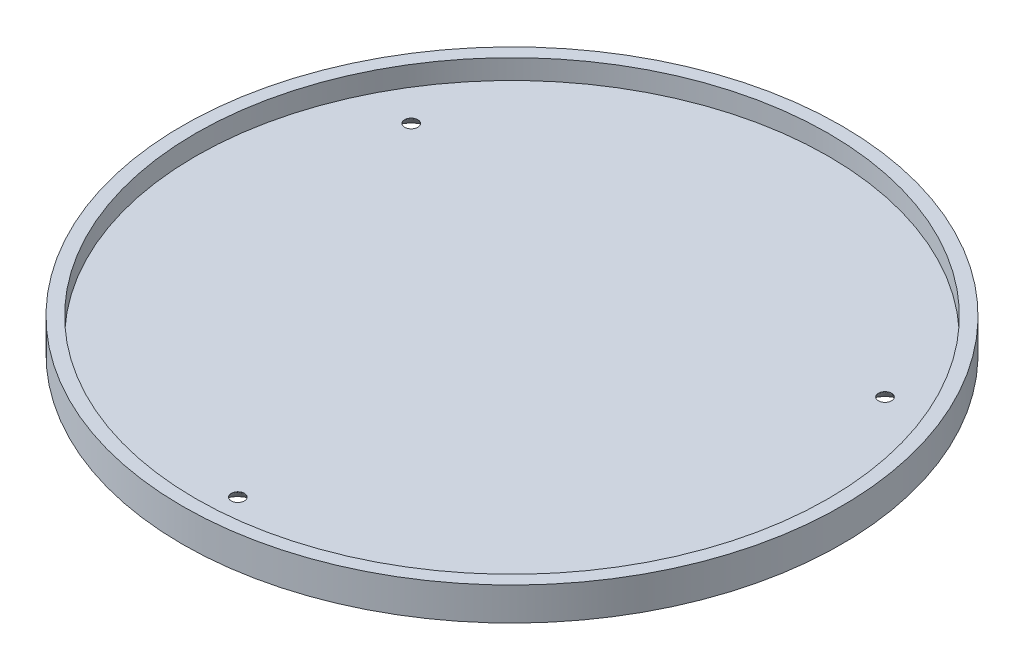
ISO-10303-21;
HEADER;
FILE_DESCRIPTION(('STEP AP214'),'2;1');
FILE_NAME('part.step','',(''),(''),'','','');
FILE_SCHEMA(('AUTOMOTIVE_DESIGN { 1 0 10303 214 1 1 1 1 }'));
ENDSEC;
DATA;
#1=APPLICATION_CONTEXT('core data for automotive mechanical design processes');
#2=APPLICATION_PROTOCOL_DEFINITION('international standard','automotive_design',2000,#1);
#3=PRODUCT_CONTEXT('',#1,'mechanical');
#4=PRODUCT('Part','Part','',(#3));
#5=PRODUCT_RELATED_PRODUCT_CATEGORY('part','',(#4));
#6=PRODUCT_DEFINITION_FORMATION('','',#4);
#7=PRODUCT_DEFINITION_CONTEXT('part definition',#1,'design');
#8=PRODUCT_DEFINITION('design','',#6,#7);
#9=PRODUCT_DEFINITION_SHAPE('','',#8);
#10=(LENGTH_UNIT() NAMED_UNIT(*) SI_UNIT(.MILLI.,.METRE.));
#11=(NAMED_UNIT(*) PLANE_ANGLE_UNIT() SI_UNIT($,.RADIAN.));
#12=(NAMED_UNIT(*) SI_UNIT($,.STERADIAN.) SOLID_ANGLE_UNIT());
#13=UNCERTAINTY_MEASURE_WITH_UNIT(LENGTH_MEASURE(1.E-05),#10,'distance_accuracy_value','');
#14=(GEOMETRIC_REPRESENTATION_CONTEXT(3) GLOBAL_UNCERTAINTY_ASSIGNED_CONTEXT((#13)) GLOBAL_UNIT_ASSIGNED_CONTEXT((#10,
#11,#12)) REPRESENTATION_CONTEXT('',''));
#15=CARTESIAN_POINT('',(0.,0.,0.));
#16=DIRECTION('',(0.,0.,1.));
#17=DIRECTION('',(1.,0.,0.));
#18=AXIS2_PLACEMENT_3D('',#15,#16,#17);
#19=CARTESIAN_POINT('',(0.,2.,0.));
#20=DIRECTION('',(0.,-1.,0.));
#21=DIRECTION('',(0.,0.,-1.));
#22=AXIS2_PLACEMENT_3D('',#19,#20,#21);
#23=CYLINDRICAL_SURFACE('',#22,50.);
#24=CARTESIAN_POINT('',(0.,0.,0.));
#25=DIRECTION('',(0.,1.,0.));
#26=DIRECTION('',(0.,0.,1.));
#27=AXIS2_PLACEMENT_3D('',#24,#25,#26);
#28=CIRCLE('',#27,50.);
#29=CARTESIAN_POINT('',(0.,0.,50.));
#30=VERTEX_POINT('',#29);
#31=EDGE_CURVE('E71',#30,#30,#28,.T.);
#32=ORIENTED_EDGE('',*,*,#31,.T.);
#33=EDGE_LOOP('',(#32));
#34=FACE_BOUND('',#33,.T.);
#35=CARTESIAN_POINT('',(0.,5.,0.));
#36=DIRECTION('',(0.,1.,0.));
#37=DIRECTION('',(0.,0.,1.));
#38=AXIS2_PLACEMENT_3D('',#35,#36,#37);
#39=CIRCLE('',#38,50.);
#40=CARTESIAN_POINT('',(0.,5.,50.));
#41=VERTEX_POINT('',#40);
#42=EDGE_CURVE('E76',#41,#41,#39,.T.);
#43=ORIENTED_EDGE('',*,*,#42,.F.);
#44=EDGE_LOOP('',(#43));
#45=FACE_BOUND('',#44,.T.);
#46=ADVANCED_FACE('F42',(#34,#45),#23,.T.);
#47=CARTESIAN_POINT('',(0.,0.,0.));
#48=DIRECTION('',(0.,1.,0.));
#49=DIRECTION('',(0.,0.,1.));
#50=AXIS2_PLACEMENT_3D('',#47,#48,#49);
#51=PLANE('',#50);
#52=CARTESIAN_POINT('',(-1.35252175889077E-13,0.,38.5985260536249));
#53=CARTESIAN_POINT('',(0.392699074426384,0.,38.5985260536249));
#54=CARTESIAN_POINT('',(0.785243659796374,0.,38.6766080264029));
#55=CARTESIAN_POINT('',(1.5108569343939,0.,38.9771668857792));
#56=CARTESIAN_POINT('',(1.84364016506682,0.,39.199525531572));
#57=CARTESIAN_POINT('',(2.3990005220522,0.,39.7548858885586));
#58=CARTESIAN_POINT('',(2.62135916784558,0.,40.0876691192299));
#59=CARTESIAN_POINT('',(2.92191802722187,0.,40.8132823938295));
#60=CARTESIAN_POINT('',(2.99999999999986,0.,41.2058269791985));
#61=CARTESIAN_POINT('',(2.99999999999986,0.,41.9912251280514));
#62=CARTESIAN_POINT('',(2.92191802722195,0.,42.3837697134218));
#63=CARTESIAN_POINT('',(2.6213591678455,0.,43.1093829880186));
#64=CARTESIAN_POINT('',(2.39900052205211,0.,43.4421662186913));
#65=CARTESIAN_POINT('',(1.8436401650669,0.,43.9975265756779));
#66=CARTESIAN_POINT('',(1.51085693439392,0.,44.2198852214707));
#67=CARTESIAN_POINT('',(0.785243659796346,0.,44.5204440808469));
#68=CARTESIAN_POINT('',(0.392699074426768,0.,44.5985260536249));
#69=CARTESIAN_POINT('',(-0.392699074427039,0.,44.5985260536249));
#70=CARTESIAN_POINT('',(-0.785243659796701,0.,44.5204440808469));
#71=CARTESIAN_POINT('',(-1.51085693439411,0.,44.2198852214707));
#72=CARTESIAN_POINT('',(-1.84364016506709,0.,43.9975265756779));
#73=CARTESIAN_POINT('',(-2.39900052205247,0.,43.4421662186913));
#74=CARTESIAN_POINT('',(-2.62135916784568,0.,43.10938298802));
#75=CARTESIAN_POINT('',(-2.92191802722231,0.,42.3837697134204));
#76=CARTESIAN_POINT('',(-3.00000000000014,0.,41.9912251280527));
#77=CARTESIAN_POINT('',(-3.00000000000014,0.,41.2058269791972));
#78=CARTESIAN_POINT('',(-2.92191802722222,0.,40.8132823938281));
#79=CARTESIAN_POINT('',(-2.62135916784577,0.,40.0876691192312));
#80=CARTESIAN_POINT('',(-2.39900052205238,0.,39.7548858885586));
#81=CARTESIAN_POINT('',(-1.84364016506717,0.,39.199525531572));
#82=CARTESIAN_POINT('',(-1.51085693439425,0.,38.9771668857792));
#83=CARTESIAN_POINT('',(-0.785243659796552,0.,38.6766080264029));
#84=CARTESIAN_POINT('',(-0.392699074426654,0.,38.5985260536249));
#85=CARTESIAN_POINT('',(-1.35252175889077E-13,0.,38.5985260536249));
#86=(BOUNDED_CURVE() B_SPLINE_CURVE(3,(#52,#53,#54,#55,#56,#57,#58,#59,#60,#61,#62,#63,#64,#65,
#66,#67,#68,#69,#70,#71,#72,#73,#74,#75,#76,#77,#78,#79,#80,#81,#82,#83,#84,#85),.UNSPECIFIED.,
.T.,.F.) B_SPLINE_CURVE_WITH_KNOTS((4,2,2,2,2,2,2,2,2,2,2,2,2,2,2,2,4),(-3.14159265358979,
-2.74889357189107,-2.35619449019234,-1.96349540849362,-1.5707963267949,-1.17809724509617,
-0.785398163397448,-0.392699081698724,0.,0.392699081698724,0.785398163397448,1.17809724509617,
1.5707963267949,1.96349540849362,2.35619449019234,2.74889357189107,3.14159265358979),
.UNSPECIFIED.) CURVE() GEOMETRIC_REPRESENTATION_ITEM() RATIONAL_B_SPLINE_CURVE((1.,1.,1.,1.,1.,
1.,1.,1.,1.,1.,1.,1.,1.,1.,1.,1.,1.,1.,1.,1.,1.,1.,1.,1.,1.,1.,1.,1.,1.,1.,1.,1.,1.,1.)) REPRESENTATION_ITEM(''));
#87=CARTESIAN_POINT('',(-1.35252175889077E-13,0.,38.5985260536249));
#88=VERTEX_POINT('',#87);
#89=EDGE_CURVE('E11',#88,#88,#86,.F.);
#90=ORIENTED_EDGE('',*,*,#89,.T.);
#91=EDGE_LOOP('',(#90));
#92=FACE_BOUND('',#91,.T.);
#93=CARTESIAN_POINT('',(35.9400542570542,0.,-23.6514739463751));
#94=CARTESIAN_POINT('',(36.3327533314806,0.,-23.6514739463751));
#95=CARTESIAN_POINT('',(36.7252979168511,0.,-23.5733919735971));
#96=CARTESIAN_POINT('',(37.4509111914479,0.,-23.2728331142208));
#97=CARTESIAN_POINT('',(37.7836944221219,0.,-23.0504744684274));
#98=CARTESIAN_POINT('',(38.3390547791058,0.,-22.4951141114422));
#99=CARTESIAN_POINT('',(38.5614134248999,0.,-22.1623308807695));
#100=CARTESIAN_POINT('',(38.8619722842762,0.,-21.4367176061713));
#101=CARTESIAN_POINT('',(38.9400542570542,0.,-21.0441730208015));
#102=CARTESIAN_POINT('',(38.9400542570542,0.,-20.2587748719487));
#103=CARTESIAN_POINT('',(38.8619722842762,0.,-19.8662302865783));
#104=CARTESIAN_POINT('',(38.5614134248999,0.,-19.1406170119814));
#105=CARTESIAN_POINT('',(38.3390547791058,0.,-18.8078337813081));
#106=CARTESIAN_POINT('',(37.7836944221219,0.,-18.2524734243229));
#107=CARTESIAN_POINT('',(37.4509111914478,0.,-18.0301147785294));
#108=CARTESIAN_POINT('',(36.7252979168511,0.,-17.7295559191531));
#109=CARTESIAN_POINT('',(36.3327533314806,0.,-17.6514739463751));
#110=CARTESIAN_POINT('',(35.5473551826278,0.,-17.6514739463751));
#111=CARTESIAN_POINT('',(35.1548105972573,0.,-17.7295559191531));
#112=CARTESIAN_POINT('',(34.4291973226606,0.,-18.0301147785294));
#113=CARTESIAN_POINT('',(34.0964140919865,0.,-18.2524734243229));
#114=CARTESIAN_POINT('',(33.5410537350026,0.,-18.8078337813081));
#115=CARTESIAN_POINT('',(33.3186950892085,0.,-19.1406170119807));
#116=CARTESIAN_POINT('',(33.0181362298322,0.,-19.8662302865789));
#117=CARTESIAN_POINT('',(32.9400542570542,0.,-20.2587748719487));
#118=CARTESIAN_POINT('',(32.9400542570542,0.,-21.0441730208015));
#119=CARTESIAN_POINT('',(33.0181362298308,0.,-21.436717606172));
#120=CARTESIAN_POINT('',(33.3186950892098,0.,-22.1623308807688));
#121=CARTESIAN_POINT('',(33.5410537350026,0.,-22.4951141114421));
#122=CARTESIAN_POINT('',(34.0964140919865,0.,-23.0504744684274));
#123=CARTESIAN_POINT('',(34.4291973226605,0.,-23.2728331142208));
#124=CARTESIAN_POINT('',(35.1548105972574,0.,-23.5733919735971));
#125=CARTESIAN_POINT('',(35.5473551826278,0.,-23.6514739463751));
#126=CARTESIAN_POINT('',(35.9400542570542,0.,-23.6514739463751));
#127=(BOUNDED_CURVE() B_SPLINE_CURVE(3,(#93,#94,#95,#96,#97,#98,#99,#100,#101,#102,#103,#104,
#105,#106,#107,#108,#109,#110,#111,#112,#113,#114,#115,#116,#117,#118,#119,#120,#121,#122,#123,
#124,#125,#126),.UNSPECIFIED.,.T.,.F.) B_SPLINE_CURVE_WITH_KNOTS((4,2,2,2,2,2,2,2,2,2,2,2,2,2,2,
2,4),(-3.14159265358979,-2.74889357189107,-2.35619449019234,-1.96349540849362,-1.5707963267949,
-1.17809724509617,-0.785398163397448,-0.392699081698724,0.,0.392699081698724,0.785398163397448,
1.17809724509617,1.5707963267949,1.96349540849362,2.35619449019234,2.74889357189107,
3.14159265358979),
.UNSPECIFIED.) CURVE() GEOMETRIC_REPRESENTATION_ITEM() RATIONAL_B_SPLINE_CURVE((1.,1.,1.,1.,1.,
1.,1.,1.,1.,1.,1.,1.,1.,1.,1.,1.,1.,1.,1.,1.,1.,1.,1.,1.,1.,1.,1.,1.,1.,1.,1.,1.,1.,1.)) REPRESENTATION_ITEM(''));
#128=CARTESIAN_POINT('',(35.9400542570542,0.,-23.6514739463751));
#129=VERTEX_POINT('',#128);
#130=EDGE_CURVE('E56',#129,#129,#127,.F.);
#131=ORIENTED_EDGE('',*,*,#130,.T.);
#132=EDGE_LOOP('',(#131));
#133=FACE_BOUND('',#132,.T.);
#134=CARTESIAN_POINT('',(-35.9400542570543,0.,-23.6514739463749));
#135=CARTESIAN_POINT('',(-35.5473551826279,0.,-23.6514739463749));
#136=CARTESIAN_POINT('',(-35.1548105972575,0.,-23.5733919735969));
#137=CARTESIAN_POINT('',(-34.4291973226606,0.,-23.2728331142206));
#138=CARTESIAN_POINT('',(-34.0964140919866,0.,-23.0504744684278));
#139=CARTESIAN_POINT('',(-33.5410537350027,0.,-22.4951141114412));
#140=CARTESIAN_POINT('',(-33.3186950892086,0.,-22.1623308807686));
#141=CARTESIAN_POINT('',(-33.0181362298323,0.,-21.4367176061717));
#142=CARTESIAN_POINT('',(-32.9400542570543,0.,-21.0441730208013));
#143=CARTESIAN_POINT('',(-32.9400542570543,0.,-20.2587748719484));
#144=CARTESIAN_POINT('',(-33.0181362298323,0.,-19.8662302865787));
#145=CARTESIAN_POINT('',(-33.3186950892086,0.,-19.1406170119805));
#146=CARTESIAN_POINT('',(-33.5410537350014,0.,-18.8078337813078));
#147=CARTESIAN_POINT('',(-34.096414091988,0.,-18.2524734243226));
#148=CARTESIAN_POINT('',(-34.4291973226607,0.,-18.0301147785284));
#149=CARTESIAN_POINT('',(-35.1548105972574,0.,-17.7295559191536));
#150=CARTESIAN_POINT('',(-35.547355182628,0.,-17.6514739463749));
#151=CARTESIAN_POINT('',(-36.3327533314807,0.,-17.6514739463749));
#152=CARTESIAN_POINT('',(-36.7252979168499,0.,-17.7295559191529));
#153=CARTESIAN_POINT('',(-37.4509111914493,0.,-18.0301147785291));
#154=CARTESIAN_POINT('',(-37.7836944221207,0.,-18.2524734243226));
#155=CARTESIAN_POINT('',(-38.3390547791072,0.,-18.8078337813078));
#156=CARTESIAN_POINT('',(-38.5614134249,0.,-19.1406170119805));
#157=CARTESIAN_POINT('',(-38.8619722842763,0.,-19.8662302865787));
#158=CARTESIAN_POINT('',(-38.9400542570543,0.,-20.2587748719484));
#159=CARTESIAN_POINT('',(-38.9400542570543,0.,-21.0441730208013));
#160=CARTESIAN_POINT('',(-38.8619722842763,0.,-21.436717606171));
#161=CARTESIAN_POINT('',(-38.5614134249,0.,-22.1623308807692));
#162=CARTESIAN_POINT('',(-38.3390547791072,0.,-22.4951141114419));
#163=CARTESIAN_POINT('',(-37.7836944221207,0.,-23.0504744684271));
#164=CARTESIAN_POINT('',(-37.450911191448,0.,-23.2728331142206));
#165=CARTESIAN_POINT('',(-36.7252979168512,0.,-23.5733919735969));
#166=CARTESIAN_POINT('',(-36.3327533314807,0.,-23.6514739463749));
#167=CARTESIAN_POINT('',(-35.9400542570543,0.,-23.6514739463749));
#168=(BOUNDED_CURVE() B_SPLINE_CURVE(3,(#134,#135,#136,#137,#138,#139,#140,#141,#142,#143,#144,
#145,#146,#147,#148,#149,#150,#151,#152,#153,#154,#155,#156,#157,#158,#159,#160,#161,#162,#163,
#164,#165,#166,#167),.UNSPECIFIED.,.T.,.F.) B_SPLINE_CURVE_WITH_KNOTS((4,2,2,2,2,2,2,2,2,2,2,2,
2,2,2,2,4),(-3.14159265358979,-2.74889357189107,-2.35619449019234,-1.96349540849362,
-1.5707963267949,-1.17809724509617,-0.785398163397448,-0.392699081698724,0.,0.392699081698724,
0.785398163397448,1.17809724509617,1.5707963267949,1.96349540849362,2.35619449019234,
2.74889357189107,3.14159265358979),
.UNSPECIFIED.) CURVE() GEOMETRIC_REPRESENTATION_ITEM() RATIONAL_B_SPLINE_CURVE((1.,1.,1.,1.,1.,
1.,1.,1.,1.,1.,1.,1.,1.,1.,1.,1.,1.,1.,1.,1.,1.,1.,1.,1.,1.,1.,1.,1.,1.,1.,1.,1.,1.,1.)) REPRESENTATION_ITEM(''));
#169=CARTESIAN_POINT('',(-35.9400542570543,0.,-23.6514739463749));
#170=VERTEX_POINT('',#169);
#171=EDGE_CURVE('E61',#170,#170,#168,.F.);
#172=ORIENTED_EDGE('',*,*,#171,.T.);
#173=EDGE_LOOP('',(#172));
#174=FACE_BOUND('',#173,.T.);
#175=ORIENTED_EDGE('',*,*,#31,.F.);
#176=EDGE_LOOP('',(#175));
#177=FACE_BOUND('',#176,.T.);
#178=ADVANCED_FACE('F84',(#92,#133,#174,#177),#51,.F.);
#179=CARTESIAN_POINT('',(0.,5.,0.));
#180=DIRECTION('',(0.,1.,0.));
#181=DIRECTION('',(0.,0.,1.));
#182=AXIS2_PLACEMENT_3D('',#179,#180,#181);
#183=PLANE('',#182);
#184=ORIENTED_EDGE('',*,*,#42,.T.);
#185=EDGE_LOOP('',(#184));
#186=FACE_BOUND('',#185,.T.);
#187=CARTESIAN_POINT('',(0.,5.,0.));
#188=DIRECTION('',(0.,1.,0.));
#189=DIRECTION('',(0.,0.,1.));
#190=AXIS2_PLACEMENT_3D('',#187,#188,#189);
#191=CIRCLE('',#190,48.);
#192=CARTESIAN_POINT('',(0.,5.,48.));
#193=VERTEX_POINT('',#192);
#194=EDGE_CURVE('E224',#193,#193,#191,.T.);
#195=ORIENTED_EDGE('',*,*,#194,.F.);
#196=EDGE_LOOP('',(#195));
#197=FACE_BOUND('',#196,.T.);
#198=ADVANCED_FACE('F93',(#186,#197),#183,.T.);
#199=CARTESIAN_POINT('',(0.,5.,0.));
#200=DIRECTION('',(0.,-1.,0.));
#201=DIRECTION('',(0.,0.,-1.));
#202=AXIS2_PLACEMENT_3D('',#199,#200,#201);
#203=CYLINDRICAL_SURFACE('',#202,48.);
#204=ORIENTED_EDGE('',*,*,#194,.T.);
#205=EDGE_LOOP('',(#204));
#206=FACE_BOUND('',#205,.T.);
#207=CARTESIAN_POINT('',(0.,2.,0.));
#208=DIRECTION('',(0.,1.,0.));
#209=DIRECTION('',(0.,0.,1.));
#210=AXIS2_PLACEMENT_3D('',#207,#208,#209);
#211=CIRCLE('',#210,48.);
#212=CARTESIAN_POINT('',(0.,2.,48.));
#213=VERTEX_POINT('',#212);
#214=EDGE_CURVE('E66',#213,#213,#211,.F.);
#215=ORIENTED_EDGE('',*,*,#214,.T.);
#216=EDGE_LOOP('',(#215));
#217=FACE_BOUND('',#216,.T.);
#218=ADVANCED_FACE('F256',(#206,#217),#203,.F.);
#219=CARTESIAN_POINT('',(0.,2.,0.));
#220=DIRECTION('',(0.,1.,0.));
#221=DIRECTION('',(0.,0.,1.));
#222=AXIS2_PLACEMENT_3D('',#219,#220,#221);
#223=PLANE('',#222);
#224=CARTESIAN_POINT('',(-1.35497105248907E-13,2.,40.5985260536249));
#225=CARTESIAN_POINT('',(-0.130899691475642,2.,40.5985260536249));
#226=CARTESIAN_POINT('',(-0.261747886599258,2.,40.6245533778844));
#227=CARTESIAN_POINT('',(-0.50361897813119,2.,40.7247396643429));
#228=CARTESIAN_POINT('',(-0.614546721688915,2.,40.7988592129406));
#229=CARTESIAN_POINT('',(-0.799666840684453,2.,40.9839793319362));
#230=CARTESIAN_POINT('',(-0.873786389282064,2.,41.0949070754936));
#231=CARTESIAN_POINT('',(-0.973972675740781,2.,41.3367781670261));
#232=CARTESIAN_POINT('',(-1.00000000000014,2.,41.4676263621486));
#233=CARTESIAN_POINT('',(-1.00000000000014,2.,41.7294257451013));
#234=CARTESIAN_POINT('',(-0.973972675740756,2.,41.8602739402239));
#235=CARTESIAN_POINT('',(-0.873786389282089,2.,42.1021450317562));
#236=CARTESIAN_POINT('',(-0.799666840684451,2.,42.2130727753137));
#237=CARTESIAN_POINT('',(-0.614546721688913,2.,42.3981928943093));
#238=CARTESIAN_POINT('',(-0.503618978131135,2.,42.472312442907));
#239=CARTESIAN_POINT('',(-0.261747886599316,2.,42.5724987293655));
#240=CARTESIAN_POINT('',(-0.13089969147577,2.,42.5985260536249));
#241=CARTESIAN_POINT('',(0.130899691475499,2.,42.5985260536249));
#242=CARTESIAN_POINT('',(0.261747886599027,2.,42.5724987293655));
#243=CARTESIAN_POINT('',(0.503618978130882,2.,42.472312442907));
#244=CARTESIAN_POINT('',(0.614546721688643,2.,42.3981928943093));
#245=CARTESIAN_POINT('',(0.799666840684181,2.,42.2130727753137));
#246=CARTESIAN_POINT('',(0.873786389281781,2.,42.1021450317563));
#247=CARTESIAN_POINT('',(0.973972675740522,2.,41.8602739402238));
#248=CARTESIAN_POINT('',(0.999999999999864,2.,41.7294257451013));
#249=CARTESIAN_POINT('',(0.999999999999864,2.,41.4676263621486));
#250=CARTESIAN_POINT('',(0.973972675740453,2.,41.3367781670259));
#251=CARTESIAN_POINT('',(0.873786389281848,2.,41.0949070754938));
#252=CARTESIAN_POINT('',(0.799666840684201,2.,40.9839793319362));
#253=CARTESIAN_POINT('',(0.61454672168862,2.,40.7988592129406));
#254=CARTESIAN_POINT('',(0.503618978131384,2.,40.7247396643431));
#255=CARTESIAN_POINT('',(0.261747886598526,2.,40.6245533778842));
#256=CARTESIAN_POINT('',(0.130899691475371,2.,40.5985260536249));
#257=CARTESIAN_POINT('',(-1.35497105248907E-13,2.,40.5985260536249));
#258=(BOUNDED_CURVE() B_SPLINE_CURVE(3,(#224,#225,#226,#227,#228,#229,#230,#231,#232,#233,#234,
#235,#236,#237,#238,#239,#240,#241,#242,#243,#244,#245,#246,#247,#248,#249,#250,#251,#252,#253,
#254,#255,#256,#257),.UNSPECIFIED.,.T.,.F.) B_SPLINE_CURVE_WITH_KNOTS((4,2,2,2,2,2,2,2,2,2,2,2,
2,2,2,2,4),(-3.14159265358979,-2.74889357189107,-2.35619449019234,-1.96349540849362,
-1.5707963267949,-1.17809724509617,-0.785398163397448,-0.392699081698724,0.,0.392699081698724,
0.785398163397448,1.17809724509617,1.5707963267949,1.96349540849362,2.35619449019234,
2.74889357189107,3.14159265358979),
.UNSPECIFIED.) CURVE() GEOMETRIC_REPRESENTATION_ITEM() RATIONAL_B_SPLINE_CURVE((1.,1.,1.,1.,1.,
1.,1.,1.,1.,1.,1.,1.,1.,1.,1.,1.,1.,1.,1.,1.,1.,1.,1.,1.,1.,1.,1.,1.,1.,1.,1.,1.,1.,1.)) REPRESENTATION_ITEM(''));
#259=CARTESIAN_POINT('',(-1.35497105248907E-13,2.,40.5985260536249));
#260=VERTEX_POINT('',#259);
#261=EDGE_CURVE('E120',#260,#260,#258,.T.);
#262=ORIENTED_EDGE('',*,*,#261,.F.);
#263=EDGE_LOOP('',(#262));
#264=FACE_BOUND('',#263,.T.);
#265=CARTESIAN_POINT('',(-35.9400542570543,2.,-21.6514739463749));
#266=CARTESIAN_POINT('',(-36.0709539485307,2.,-21.6514739463749));
#267=CARTESIAN_POINT('',(-36.2018021436531,2.,-21.6254466221155));
#268=CARTESIAN_POINT('',(-36.4436732351857,2.,-21.5252603356567));
#269=CARTESIAN_POINT('',(-36.5546009787433,2.,-21.4511407870589));
#270=CARTESIAN_POINT('',(-36.7397210977384,2.,-21.2660206680639));
#271=CARTESIAN_POINT('',(-36.8138406463362,2.,-21.1550929245064));
#272=CARTESIAN_POINT('',(-36.914026932795,2.,-20.9132218329735));
#273=CARTESIAN_POINT('',(-36.9400542570543,2.,-20.7823736378506));
#274=CARTESIAN_POINT('',(-36.9400542570543,2.,-20.5205742548992));
#275=CARTESIAN_POINT('',(-36.9140269327948,2.,-20.3897260597756));
#276=CARTESIAN_POINT('',(-36.8138406463364,2.,-20.1478549682439));
#277=CARTESIAN_POINT('',(-36.7397210977384,2.,-20.0369272246858));
#278=CARTESIAN_POINT('',(-36.5546009787433,2.,-19.8518071056908));
#279=CARTESIAN_POINT('',(-36.4436732351855,2.,-19.7776875570929));
#280=CARTESIAN_POINT('',(-36.2018021436533,2.,-19.6775012706343));
#281=CARTESIAN_POINT('',(-36.0709539485307,2.,-19.6514739463749));
#282=CARTESIAN_POINT('',(-35.8091545655779,2.,-19.6514739463749));
#283=CARTESIAN_POINT('',(-35.6783063704553,2.,-19.6775012706343));
#284=CARTESIAN_POINT('',(-35.4364352789232,2.,-19.7776875570929));
#285=CARTESIAN_POINT('',(-35.3255075353653,2.,-19.8518071056908));
#286=CARTESIAN_POINT('',(-35.1403874163702,2.,-20.0369272246858));
#287=CARTESIAN_POINT('',(-35.0662678677722,2.,-20.1478549682439));
#288=CARTESIAN_POINT('',(-34.9660815813138,2.,-20.3897260597756));
#289=CARTESIAN_POINT('',(-34.9400542570543,2.,-20.5205742548998));
#290=CARTESIAN_POINT('',(-34.9400542570543,2.,-20.7823736378499));
#291=CARTESIAN_POINT('',(-34.9660815813138,2.,-20.9132218329741));
#292=CARTESIAN_POINT('',(-35.0662678677722,2.,-21.1550929245058));
#293=CARTESIAN_POINT('',(-35.1403874163702,2.,-21.2660206680639));
#294=CARTESIAN_POINT('',(-35.3255075353653,2.,-21.4511407870589));
#295=CARTESIAN_POINT('',(-35.4364352789231,2.,-21.5252603356568));
#296=CARTESIAN_POINT('',(-35.6783063704553,2.,-21.6254466221154));
#297=CARTESIAN_POINT('',(-35.8091545655779,2.,-21.6514739463749));
#298=CARTESIAN_POINT('',(-35.9400542570543,2.,-21.6514739463749));
#299=(BOUNDED_CURVE() B_SPLINE_CURVE(3,(#265,#266,#267,#268,#269,#270,#271,#272,#273,#274,#275,
#276,#277,#278,#279,#280,#281,#282,#283,#284,#285,#286,#287,#288,#289,#290,#291,#292,#293,#294,
#295,#296,#297,#298),.UNSPECIFIED.,.T.,.F.) B_SPLINE_CURVE_WITH_KNOTS((4,2,2,2,2,2,2,2,2,2,2,2,
2,2,2,2,4),(-3.14159265358979,-2.74889357189107,-2.35619449019234,-1.96349540849362,
-1.5707963267949,-1.17809724509617,-0.785398163397448,-0.392699081698724,0.,0.392699081698724,
0.785398163397448,1.17809724509617,1.5707963267949,1.96349540849362,2.35619449019234,
2.74889357189107,3.14159265358979),
.UNSPECIFIED.) CURVE() GEOMETRIC_REPRESENTATION_ITEM() RATIONAL_B_SPLINE_CURVE((1.,1.,1.,1.,1.,
1.,1.,1.,1.,1.,1.,1.,1.,1.,1.,1.,1.,1.,1.,1.,1.,1.,1.,1.,1.,1.,1.,1.,1.,1.,1.,1.,1.,1.)) REPRESENTATION_ITEM(''));
#300=CARTESIAN_POINT('',(-35.9400542570543,2.,-21.6514739463749));
#301=VERTEX_POINT('',#300);
#302=EDGE_CURVE('E205',#301,#301,#299,.T.);
#303=ORIENTED_EDGE('',*,*,#302,.F.);
#304=EDGE_LOOP('',(#303));
#305=FACE_BOUND('',#304,.T.);
#306=CARTESIAN_POINT('',(35.9400542570542,2.,-21.6514739463751));
#307=CARTESIAN_POINT('',(35.8091545655778,2.,-21.6514739463751));
#308=CARTESIAN_POINT('',(35.6783063704552,2.,-21.6254466221157));
#309=CARTESIAN_POINT('',(35.436435278923,2.,-21.5252603356571));
#310=CARTESIAN_POINT('',(35.3255075353652,2.,-21.4511407870592));
#311=CARTESIAN_POINT('',(35.1403874163701,2.,-21.2660206680641));
#312=CARTESIAN_POINT('',(35.0662678677723,2.,-21.1550929245065));
#313=CARTESIAN_POINT('',(34.9660815813135,2.,-20.9132218329739));
#314=CARTESIAN_POINT('',(34.9400542570542,2.,-20.7823736378508));
#315=CARTESIAN_POINT('',(34.9400542570542,2.,-20.5205742548994));
#316=CARTESIAN_POINT('',(34.9660815813137,2.,-20.3897260597758));
#317=CARTESIAN_POINT('',(35.0662678677721,2.,-20.1478549682442));
#318=CARTESIAN_POINT('',(35.1403874163705,2.,-20.0369272246857));
#319=CARTESIAN_POINT('',(35.3255075353648,2.,-19.8518071056914));
#320=CARTESIAN_POINT('',(35.436435278924,2.,-19.7776875570927));
#321=CARTESIAN_POINT('',(35.6783063704543,2.,-19.6775012706349));
#322=CARTESIAN_POINT('',(35.8091545655778,2.,-19.6514739463751));
#323=CARTESIAN_POINT('',(36.0709539485306,2.,-19.6514739463751));
#324=CARTESIAN_POINT('',(36.2018021436542,2.,-19.6775012706349));
#325=CARTESIAN_POINT('',(36.4436732351844,2.,-19.7776875570927));
#326=CARTESIAN_POINT('',(36.5546009787432,2.,-19.851807105691));
#327=CARTESIAN_POINT('',(36.7397210977383,2.,-20.0369272246861));
#328=CARTESIAN_POINT('',(36.8138406463363,2.,-20.1478549682442));
#329=CARTESIAN_POINT('',(36.9140269327947,2.,-20.3897260597759));
#330=CARTESIAN_POINT('',(36.9400542570542,2.,-20.5205742549001));
#331=CARTESIAN_POINT('',(36.9400542570542,2.,-20.7823736378501));
#332=CARTESIAN_POINT('',(36.9140269327947,2.,-20.9132218329744));
#333=CARTESIAN_POINT('',(36.8138406463363,2.,-21.155092924506));
#334=CARTESIAN_POINT('',(36.739721097738,2.,-21.2660206680645));
#335=CARTESIAN_POINT('',(36.5546009787436,2.,-21.4511407870589));
#336=CARTESIAN_POINT('',(36.4436732351845,2.,-21.5252603356575));
#337=CARTESIAN_POINT('',(36.2018021436541,2.,-21.6254466221153));
#338=CARTESIAN_POINT('',(36.0709539485306,2.,-21.6514739463751));
#339=CARTESIAN_POINT('',(35.9400542570542,2.,-21.6514739463751));
#340=(BOUNDED_CURVE() B_SPLINE_CURVE(3,(#306,#307,#308,#309,#310,#311,#312,#313,#314,#315,#316,
#317,#318,#319,#320,#321,#322,#323,#324,#325,#326,#327,#328,#329,#330,#331,#332,#333,#334,#335,
#336,#337,#338,#339),.UNSPECIFIED.,.T.,.F.) B_SPLINE_CURVE_WITH_KNOTS((4,2,2,2,2,2,2,2,2,2,2,2,
2,2,2,2,4),(-3.14159265358979,-2.74889357189107,-2.35619449019234,-1.96349540849362,
-1.5707963267949,-1.17809724509617,-0.785398163397448,-0.392699081698724,0.,0.392699081698724,
0.785398163397448,1.17809724509617,1.5707963267949,1.96349540849362,2.35619449019234,
2.74889357189107,3.14159265358979),
.UNSPECIFIED.) CURVE() GEOMETRIC_REPRESENTATION_ITEM() RATIONAL_B_SPLINE_CURVE((1.,1.,1.,1.,1.,
1.,1.,1.,1.,1.,1.,1.,1.,1.,1.,1.,1.,1.,1.,1.,1.,1.,1.,1.,1.,1.,1.,1.,1.,1.,1.,1.,1.,1.)) REPRESENTATION_ITEM(''));
#341=CARTESIAN_POINT('',(35.9400542570542,2.,-21.6514739463751));
#342=VERTEX_POINT('',#341);
#343=EDGE_CURVE('E172',#342,#342,#340,.T.);
#344=ORIENTED_EDGE('',*,*,#343,.F.);
#345=EDGE_LOOP('',(#344));
#346=FACE_BOUND('',#345,.T.);
#347=ORIENTED_EDGE('',*,*,#214,.F.);
#348=EDGE_LOOP('',(#347));
#349=FACE_BOUND('',#348,.T.);
#350=ADVANCED_FACE('F94',(#264,#305,#346,#349),#223,.T.);
#351=CARTESIAN_POINT('',(-1.35252175889077E-13,0.,38.5985260536249));
#352=CARTESIAN_POINT('',(-0.392699074426654,0.,38.5985260536249));
#353=CARTESIAN_POINT('',(-0.785243659796552,0.,38.6766080264029));
#354=CARTESIAN_POINT('',(-1.51085693439425,0.,38.9771668857792));
#355=CARTESIAN_POINT('',(-1.84364016506717,0.,39.199525531572));
#356=CARTESIAN_POINT('',(-2.39900052205238,0.,39.7548858885586));
#357=CARTESIAN_POINT('',(-2.62135916784577,0.,40.0876691192312));
#358=CARTESIAN_POINT('',(-2.92191802722222,0.,40.8132823938281));
#359=CARTESIAN_POINT('',(-3.00000000000014,0.,41.2058269791972));
#360=CARTESIAN_POINT('',(-3.00000000000014,0.,41.9912251280527));
#361=CARTESIAN_POINT('',(-2.92191802722231,0.,42.3837697134204));
#362=CARTESIAN_POINT('',(-2.62135916784568,0.,43.10938298802));
#363=CARTESIAN_POINT('',(-2.39900052205247,0.,43.4421662186913));
#364=CARTESIAN_POINT('',(-1.84364016506709,0.,43.9975265756779));
#365=CARTESIAN_POINT('',(-1.51085693439411,0.,44.2198852214707));
#366=CARTESIAN_POINT('',(-0.785243659796701,0.,44.5204440808469));
#367=CARTESIAN_POINT('',(-0.392699074427039,0.,44.5985260536249));
#368=CARTESIAN_POINT('',(0.392699074426768,0.,44.5985260536249));
#369=CARTESIAN_POINT('',(0.785243659796346,0.,44.5204440808469));
#370=CARTESIAN_POINT('',(1.51085693439392,0.,44.2198852214707));
#371=CARTESIAN_POINT('',(1.8436401650669,0.,43.9975265756779));
#372=CARTESIAN_POINT('',(2.39900052205211,0.,43.4421662186913));
#373=CARTESIAN_POINT('',(2.6213591678455,0.,43.1093829880186));
#374=CARTESIAN_POINT('',(2.92191802722195,0.,42.3837697134218));
#375=CARTESIAN_POINT('',(2.99999999999986,0.,41.9912251280514));
#376=CARTESIAN_POINT('',(2.99999999999986,0.,41.2058269791985));
#377=CARTESIAN_POINT('',(2.92191802722187,0.,40.8132823938295));
#378=CARTESIAN_POINT('',(2.62135916784558,0.,40.0876691192299));
#379=CARTESIAN_POINT('',(2.3990005220522,0.,39.7548858885586));
#380=CARTESIAN_POINT('',(1.84364016506682,0.,39.199525531572));
#381=CARTESIAN_POINT('',(1.5108569343939,0.,38.9771668857792));
#382=CARTESIAN_POINT('',(0.785243659796374,0.,38.6766080264029));
#383=CARTESIAN_POINT('',(0.392699074426384,0.,38.5985260536249));
#384=CARTESIAN_POINT('',(-1.35252175889077E-13,0.,38.5985260536249));
#385=CARTESIAN_POINT('',(-1.35497105248907E-13,0.,40.5985260536249));
#386=CARTESIAN_POINT('',(-0.130899691475642,0.,40.5985260536249));
#387=CARTESIAN_POINT('',(-0.261747886598956,0.,40.6245533778852));
#388=CARTESIAN_POINT('',(-0.503618978131493,0.,40.7247396643421));
#389=CARTESIAN_POINT('',(-0.614546721689362,0.,40.7988592129402));
#390=CARTESIAN_POINT('',(-0.799666840684006,0.,40.9839793319366));
#391=CARTESIAN_POINT('',(-0.873786389281844,0.,41.0949070754937));
#392=CARTESIAN_POINT('',(-0.973972675741002,0.,41.336778167026));
#393=CARTESIAN_POINT('',(-1.00000000000005,0.,41.4676263621486));
#394=CARTESIAN_POINT('',(-1.00000000000022,0.,41.7294257451013));
#395=CARTESIAN_POINT('',(-0.973972675740788,0.,41.8602739402239));
#396=CARTESIAN_POINT('',(-0.873786389282056,0.,42.1021450317562));
#397=CARTESIAN_POINT('',(-0.799666840683326,-9.30178221488993E-13,42.2130727753146));
#398=CARTESIAN_POINT('',(-0.614546721690045,9.43188647558819E-13,42.3981928943083));
#399=CARTESIAN_POINT('',(-0.503618978130985,-1.27556086905641E-12,42.4723124429078));
#400=CARTESIAN_POINT('',(-0.261747886599467,1.27903031600836E-12,42.5724987293647));
#401=CARTESIAN_POINT('',(-0.13089969147577,0.,42.5985260536249));
#402=CARTESIAN_POINT('',(0.130899691475499,0.,42.5985260536249));
#403=CARTESIAN_POINT('',(0.261747886599217,1.27903031600836E-12,42.5724987293647));
#404=CARTESIAN_POINT('',(0.503618978130692,-1.27556086905641E-12,42.4723124429078));
#405=CARTESIAN_POINT('',(0.614546721689774,9.43188647558819E-13,42.3981928943083));
#406=CARTESIAN_POINT('',(0.799666840683056,-9.30178221488993E-13,42.2130727753146));
#407=CARTESIAN_POINT('',(0.873786389281445,0.,42.1021450317562));
#408=CARTESIAN_POINT('',(0.973972675740858,0.,41.8602739402239));
#409=CARTESIAN_POINT('',(0.999999999999864,0.,41.7294257451013));
#410=CARTESIAN_POINT('',(0.999999999999864,0.,41.4676263621486));
#411=CARTESIAN_POINT('',(0.973972675740389,0.,41.336778167026));
#412=CARTESIAN_POINT('',(0.873786389281912,0.,41.0949070754937));
#413=CARTESIAN_POINT('',(0.799666840683818,0.,40.9839793319366));
#414=CARTESIAN_POINT('',(0.614546721689003,0.,40.7988592129402));
#415=CARTESIAN_POINT('',(0.503618978131181,0.,40.7247396643435));
#416=CARTESIAN_POINT('',(0.261747886598729,0.,40.6245533778838));
#417=CARTESIAN_POINT('',(0.130899691475371,0.,40.5985260536249));
#418=CARTESIAN_POINT('',(-1.35497105248907E-13,0.,40.5985260536249));
#419=CARTESIAN_POINT('',(-1.35497105248907E-13,2.,40.5985260536249));
#420=CARTESIAN_POINT('',(-0.130899691475642,2.,40.5985260536249));
#421=CARTESIAN_POINT('',(-0.261747886599258,2.,40.6245533778844));
#422=CARTESIAN_POINT('',(-0.50361897813119,2.,40.7247396643429));
#423=CARTESIAN_POINT('',(-0.614546721688915,2.,40.7988592129406));
#424=CARTESIAN_POINT('',(-0.799666840684453,2.,40.9839793319362));
#425=CARTESIAN_POINT('',(-0.873786389282064,2.,41.0949070754936));
#426=CARTESIAN_POINT('',(-0.973972675740781,2.,41.3367781670261));
#427=CARTESIAN_POINT('',(-1.00000000000014,2.,41.4676263621486));
#428=CARTESIAN_POINT('',(-1.00000000000014,2.,41.7294257451013));
#429=CARTESIAN_POINT('',(-0.973972675740756,2.,41.8602739402239));
#430=CARTESIAN_POINT('',(-0.873786389282089,2.,42.1021450317562));
#431=CARTESIAN_POINT('',(-0.799666840684451,2.,42.2130727753137));
#432=CARTESIAN_POINT('',(-0.614546721688913,2.,42.3981928943093));
#433=CARTESIAN_POINT('',(-0.503618978131135,2.,42.472312442907));
#434=CARTESIAN_POINT('',(-0.261747886599316,2.,42.5724987293655));
#435=CARTESIAN_POINT('',(-0.13089969147577,2.,42.5985260536249));
#436=CARTESIAN_POINT('',(0.130899691475499,2.,42.5985260536249));
#437=CARTESIAN_POINT('',(0.261747886599027,2.,42.5724987293655));
#438=CARTESIAN_POINT('',(0.503618978130882,2.,42.472312442907));
#439=CARTESIAN_POINT('',(0.614546721688643,2.,42.3981928943093));
#440=CARTESIAN_POINT('',(0.799666840684181,2.,42.2130727753137));
#441=CARTESIAN_POINT('',(0.873786389281781,2.,42.1021450317563));
#442=CARTESIAN_POINT('',(0.973972675740522,2.,41.8602739402238));
#443=CARTESIAN_POINT('',(0.999999999999864,2.,41.7294257451013));
#444=CARTESIAN_POINT('',(0.999999999999864,2.,41.4676263621486));
#445=CARTESIAN_POINT('',(0.973972675740453,2.,41.3367781670259));
#446=CARTESIAN_POINT('',(0.873786389281848,2.,41.0949070754938));
#447=CARTESIAN_POINT('',(0.799666840684201,2.,40.9839793319362));
#448=CARTESIAN_POINT('',(0.61454672168862,2.,40.7988592129406));
#449=CARTESIAN_POINT('',(0.503618978131384,2.,40.7247396643431));
#450=CARTESIAN_POINT('',(0.261747886598526,2.,40.6245533778842));
#451=CARTESIAN_POINT('',(0.130899691475371,2.,40.5985260536249));
#452=CARTESIAN_POINT('',(-1.35497105248907E-13,2.,40.5985260536249));
#453=(BOUNDED_SURFACE() B_SPLINE_SURFACE(2,3,((#351,#352,#353,#354,#355,#356,#357,#358,#359,
#360,#361,#362,#363,#364,#365,#366,#367,#368,#369,#370,#371,#372,#373,#374,#375,#376,#377,#378,
#379,#380,#381,#382,#383,#384),(#385,#386,#387,#388,#389,#390,#391,#392,#393,#394,#395,#396,
#397,#398,#399,#400,#401,#402,#403,#404,#405,#406,#407,#408,#409,#410,#411,#412,#413,#414,#415,
#416,#417,#418),(#419,#420,#421,#422,#423,#424,#425,#426,#427,#428,#429,#430,#431,#432,#433,
#434,#435,#436,#437,#438,#439,#440,#441,#442,#443,#444,#445,#446,#447,#448,#449,#450,#451,
#452)),.UNSPECIFIED.,.F.,.T.,.F.) B_SPLINE_SURFACE_WITH_KNOTS((3,3),(4,2,2,2,2,2,2,2,2,2,2,2,2,
2,2,2,4),(0.,1.),(-3.14159265358979,-2.74889357189107,-2.35619449019234,-1.96349540849362,
-1.5707963267949,-1.17809724509617,-0.785398163397448,-0.392699081698724,0.,0.392699081698724,
0.785398163397448,1.17809724509617,1.5707963267949,1.96349540849362,2.35619449019234,
2.74889357189107,3.14159265358979),
.UNSPECIFIED.) GEOMETRIC_REPRESENTATION_ITEM() RATIONAL_B_SPLINE_SURFACE(((1.,1.,1.,1.,1.,1.,1.,
1.,1.,1.,1.,1.,1.,1.,1.,1.,1.,1.,1.,1.,1.,1.,1.,1.,1.,1.,1.,1.,1.,1.,1.,1.,1.,1.),
(0.14142135623731,0.14142135623731,0.14142135623731,0.14142135623731,0.14142135623731,
0.14142135623731,0.14142135623731,0.14142135623731,0.14142135623731,0.14142135623731,
0.14142135623731,0.14142135623731,0.14142135623731,0.14142135623731,0.14142135623731,
0.14142135623731,0.14142135623731,0.14142135623731,0.14142135623731,0.14142135623731,
0.14142135623731,0.14142135623731,0.14142135623731,0.14142135623731,0.14142135623731,
0.14142135623731,0.141421356237309,0.141421356237309,0.14142135623731,0.14142135623731,
0.14142135623731,0.14142135623731,0.14142135623731,0.14142135623731),(1.,1.,1.,1.,1.,1.,1.,1.,
1.,1.,1.,1.,1.,1.,1.,1.,1.,1.,1.,1.,1.,1.,1.,1.,1.,1.,1.,1.,1.,1.,1.,1.,1.,1.))) REPRESENTATION_ITEM('') SURFACE());
#454=ORIENTED_EDGE('',*,*,#89,.F.);
#455=EDGE_LOOP('',(#454));
#456=FACE_BOUND('',#455,.T.);
#457=ORIENTED_EDGE('',*,*,#261,.T.);
#458=EDGE_LOOP('',(#457));
#459=FACE_BOUND('',#458,.T.);
#460=ADVANCED_FACE('F126',(#456,#459),#453,.T.);
#461=CARTESIAN_POINT('',(35.9400542570542,0.,-23.6514739463751));
#462=CARTESIAN_POINT('',(35.5473551826278,0.,-23.6514739463751));
#463=CARTESIAN_POINT('',(35.1548105972574,0.,-23.5733919735971));
#464=CARTESIAN_POINT('',(34.4291973226605,0.,-23.2728331142208));
#465=CARTESIAN_POINT('',(34.0964140919865,0.,-23.0504744684274));
#466=CARTESIAN_POINT('',(33.5410537350026,0.,-22.4951141114421));
#467=CARTESIAN_POINT('',(33.3186950892098,0.,-22.1623308807688));
#468=CARTESIAN_POINT('',(33.0181362298308,0.,-21.436717606172));
#469=CARTESIAN_POINT('',(32.9400542570542,0.,-21.0441730208015));
#470=CARTESIAN_POINT('',(32.9400542570542,0.,-20.2587748719487));
#471=CARTESIAN_POINT('',(33.0181362298322,0.,-19.8662302865789));
#472=CARTESIAN_POINT('',(33.3186950892085,0.,-19.1406170119807));
#473=CARTESIAN_POINT('',(33.5410537350026,0.,-18.8078337813081));
#474=CARTESIAN_POINT('',(34.0964140919865,0.,-18.2524734243229));
#475=CARTESIAN_POINT('',(34.4291973226606,0.,-18.0301147785294));
#476=CARTESIAN_POINT('',(35.1548105972573,0.,-17.7295559191531));
#477=CARTESIAN_POINT('',(35.5473551826278,0.,-17.6514739463751));
#478=CARTESIAN_POINT('',(36.3327533314806,0.,-17.6514739463751));
#479=CARTESIAN_POINT('',(36.7252979168511,0.,-17.7295559191531));
#480=CARTESIAN_POINT('',(37.4509111914478,0.,-18.0301147785294));
#481=CARTESIAN_POINT('',(37.7836944221219,0.,-18.2524734243229));
#482=CARTESIAN_POINT('',(38.3390547791058,0.,-18.8078337813081));
#483=CARTESIAN_POINT('',(38.5614134248999,0.,-19.1406170119814));
#484=CARTESIAN_POINT('',(38.8619722842762,0.,-19.8662302865783));
#485=CARTESIAN_POINT('',(38.9400542570542,0.,-20.2587748719487));
#486=CARTESIAN_POINT('',(38.9400542570542,0.,-21.0441730208015));
#487=CARTESIAN_POINT('',(38.8619722842762,0.,-21.4367176061713));
#488=CARTESIAN_POINT('',(38.5614134248999,0.,-22.1623308807695));
#489=CARTESIAN_POINT('',(38.3390547791058,0.,-22.4951141114422));
#490=CARTESIAN_POINT('',(37.7836944221219,0.,-23.0504744684274));
#491=CARTESIAN_POINT('',(37.4509111914479,0.,-23.2728331142208));
#492=CARTESIAN_POINT('',(36.7252979168511,0.,-23.5733919735971));
#493=CARTESIAN_POINT('',(36.3327533314806,0.,-23.6514739463751));
#494=CARTESIAN_POINT('',(35.9400542570542,0.,-23.6514739463751));
#495=CARTESIAN_POINT('',(35.9400542570542,0.,-21.6514739463751));
#496=CARTESIAN_POINT('',(35.8091545655778,0.,-21.6514739463751));
#497=CARTESIAN_POINT('',(35.6783063704553,-5.94336553039236E-13,-21.6254466221156));
#498=CARTESIAN_POINT('',(35.436435278923,5.9780599999119E-13,-21.5252603356572));
#499=CARTESIAN_POINT('',(35.3255075353645,-5.09183513537063E-13,-21.4511407870599));
#500=CARTESIAN_POINT('',(35.1403874163708,5.12652960489016E-13,-21.2660206680634));
#501=CARTESIAN_POINT('',(35.0662678677727,2.57193841982497E-13,-21.1550929245057));
#502=CARTESIAN_POINT('',(34.9660815813131,-2.53724395030543E-13,-20.9132218329747));
#503=CARTESIAN_POINT('',(34.9400542570542,0.,-20.7823736378508));
#504=CARTESIAN_POINT('',(34.9400542570542,0.,-20.5205742548994));
#505=CARTESIAN_POINT('',(34.9660815813144,0.,-20.3897260597762));
#506=CARTESIAN_POINT('',(35.0662678677714,0.,-20.1478549682439));
#507=CARTESIAN_POINT('',(35.1403874163708,0.,-20.0369272246861));
#508=CARTESIAN_POINT('',(35.3255075353645,0.,-19.851807105691));
#509=CARTESIAN_POINT('',(35.4364352789244,0.,-19.7776875570936));
#510=CARTESIAN_POINT('',(35.6783063704539,0.,-19.677501270634));
#511=CARTESIAN_POINT('',(35.8091545655778,0.,-19.6514739463751));
#512=CARTESIAN_POINT('',(36.0709539485306,0.,-19.6514739463751));
#513=CARTESIAN_POINT('',(36.2018021436545,0.,-19.677501270634));
#514=CARTESIAN_POINT('',(36.4436732351841,0.,-19.7776875570936));
#515=CARTESIAN_POINT('',(36.5546009787439,0.,-19.8518071056903));
#516=CARTESIAN_POINT('',(36.7397210977376,0.,-20.0369272246868));
#517=CARTESIAN_POINT('',(36.813840646337,0.,-20.1478549682439));
#518=CARTESIAN_POINT('',(36.914026932794,0.,-20.3897260597762));
#519=CARTESIAN_POINT('',(36.9400542570542,0.,-20.5205742549001));
#520=CARTESIAN_POINT('',(36.9400542570542,0.,-20.7823736378501));
#521=CARTESIAN_POINT('',(36.914026932794,0.,-20.9132218329741));
#522=CARTESIAN_POINT('',(36.813840646337,0.,-21.1550929245063));
#523=CARTESIAN_POINT('',(36.7397210977376,5.12652960489016E-13,-21.2660206680634));
#524=CARTESIAN_POINT('',(36.5546009787439,-5.09183513537063E-13,-21.4511407870599));
#525=CARTESIAN_POINT('',(36.4436732351841,0.,-21.5252603356566));
#526=CARTESIAN_POINT('',(36.2018021436545,0.,-21.6254466221162));
#527=CARTESIAN_POINT('',(36.0709539485306,0.,-21.6514739463751));
#528=CARTESIAN_POINT('',(35.9400542570542,0.,-21.6514739463751));
#529=CARTESIAN_POINT('',(35.9400542570542,2.,-21.6514739463751));
#530=CARTESIAN_POINT('',(35.8091545655778,2.,-21.6514739463751));
#531=CARTESIAN_POINT('',(35.6783063704552,2.,-21.6254466221157));
#532=CARTESIAN_POINT('',(35.436435278923,2.,-21.5252603356571));
#533=CARTESIAN_POINT('',(35.3255075353652,2.,-21.4511407870592));
#534=CARTESIAN_POINT('',(35.1403874163701,2.,-21.2660206680641));
#535=CARTESIAN_POINT('',(35.0662678677723,2.,-21.1550929245065));
#536=CARTESIAN_POINT('',(34.9660815813135,2.,-20.9132218329739));
#537=CARTESIAN_POINT('',(34.9400542570542,2.,-20.7823736378508));
#538=CARTESIAN_POINT('',(34.9400542570542,2.,-20.5205742548994));
#539=CARTESIAN_POINT('',(34.9660815813137,2.,-20.3897260597758));
#540=CARTESIAN_POINT('',(35.0662678677721,2.,-20.1478549682442));
#541=CARTESIAN_POINT('',(35.1403874163705,2.,-20.0369272246857));
#542=CARTESIAN_POINT('',(35.3255075353648,2.,-19.8518071056914));
#543=CARTESIAN_POINT('',(35.436435278924,2.,-19.7776875570927));
#544=CARTESIAN_POINT('',(35.6783063704543,2.,-19.6775012706349));
#545=CARTESIAN_POINT('',(35.8091545655778,2.,-19.6514739463751));
#546=CARTESIAN_POINT('',(36.0709539485306,2.,-19.6514739463751));
#547=CARTESIAN_POINT('',(36.2018021436542,2.,-19.6775012706349));
#548=CARTESIAN_POINT('',(36.4436732351844,2.,-19.7776875570927));
#549=CARTESIAN_POINT('',(36.5546009787432,2.,-19.851807105691));
#550=CARTESIAN_POINT('',(36.7397210977383,2.,-20.0369272246861));
#551=CARTESIAN_POINT('',(36.8138406463363,2.,-20.1478549682442));
#552=CARTESIAN_POINT('',(36.9140269327947,2.,-20.3897260597759));
#553=CARTESIAN_POINT('',(36.9400542570542,2.,-20.5205742549001));
#554=CARTESIAN_POINT('',(36.9400542570542,2.,-20.7823736378501));
#555=CARTESIAN_POINT('',(36.9140269327947,2.,-20.9132218329744));
#556=CARTESIAN_POINT('',(36.8138406463363,2.,-21.155092924506));
#557=CARTESIAN_POINT('',(36.739721097738,2.,-21.2660206680645));
#558=CARTESIAN_POINT('',(36.5546009787436,2.,-21.4511407870589));
#559=CARTESIAN_POINT('',(36.4436732351845,2.,-21.5252603356575));
#560=CARTESIAN_POINT('',(36.2018021436541,2.,-21.6254466221153));
#561=CARTESIAN_POINT('',(36.0709539485306,2.,-21.6514739463751));
#562=CARTESIAN_POINT('',(35.9400542570542,2.,-21.6514739463751));
#563=(BOUNDED_SURFACE() B_SPLINE_SURFACE(2,3,((#461,#462,#463,#464,#465,#466,#467,#468,#469,
#470,#471,#472,#473,#474,#475,#476,#477,#478,#479,#480,#481,#482,#483,#484,#485,#486,#487,#488,
#489,#490,#491,#492,#493,#494),(#495,#496,#497,#498,#499,#500,#501,#502,#503,#504,#505,#506,
#507,#508,#509,#510,#511,#512,#513,#514,#515,#516,#517,#518,#519,#520,#521,#522,#523,#524,#525,
#526,#527,#528),(#529,#530,#531,#532,#533,#534,#535,#536,#537,#538,#539,#540,#541,#542,#543,
#544,#545,#546,#547,#548,#549,#550,#551,#552,#553,#554,#555,#556,#557,#558,#559,#560,#561,
#562)),.UNSPECIFIED.,.F.,.T.,.F.) B_SPLINE_SURFACE_WITH_KNOTS((3,3),(4,2,2,2,2,2,2,2,2,2,2,2,2,
2,2,2,4),(0.,1.),(-3.14159265358979,-2.74889357189107,-2.35619449019234,-1.96349540849362,
-1.5707963267949,-1.17809724509617,-0.785398163397448,-0.392699081698724,0.,0.392699081698724,
0.785398163397448,1.17809724509617,1.5707963267949,1.96349540849362,2.35619449019234,
2.74889357189107,3.14159265358979),
.UNSPECIFIED.) GEOMETRIC_REPRESENTATION_ITEM() RATIONAL_B_SPLINE_SURFACE(((1.,1.,1.,1.,1.,1.,1.,
1.,1.,1.,1.,1.,1.,1.,1.,1.,1.,1.,1.,1.,1.,1.,1.,1.,1.,1.,1.,1.,1.,1.,1.,1.,1.,1.),
(0.141421356237309,0.141421356237309,0.14142135623731,0.14142135623731,0.14142135623731,
0.14142135623731,0.14142135623731,0.14142135623731,0.14142135623731,0.14142135623731,
0.14142135623731,0.14142135623731,0.141421356237309,0.141421356237309,0.14142135623731,
0.14142135623731,0.141421356237309,0.141421356237309,0.14142135623731,0.14142135623731,
0.14142135623731,0.14142135623731,0.14142135623731,0.14142135623731,0.14142135623731,
0.14142135623731,0.14142135623731,0.14142135623731,0.141421356237309,0.141421356237309,
0.141421356237309,0.141421356237309,0.141421356237309,0.141421356237309),(1.,1.,1.,1.,1.,1.,1.,
1.,1.,1.,1.,1.,1.,1.,1.,1.,1.,1.,1.,1.,1.,1.,1.,1.,1.,1.,1.,1.,1.,1.,1.,1.,1.,1.))) REPRESENTATION_ITEM('') SURFACE());
#564=ORIENTED_EDGE('',*,*,#130,.F.);
#565=EDGE_LOOP('',(#564));
#566=FACE_BOUND('',#565,.T.);
#567=ORIENTED_EDGE('',*,*,#343,.T.);
#568=EDGE_LOOP('',(#567));
#569=FACE_BOUND('',#568,.T.);
#570=ADVANCED_FACE('F139',(#566,#569),#563,.T.);
#571=CARTESIAN_POINT('',(-35.9400542570543,0.,-23.6514739463749));
#572=CARTESIAN_POINT('',(-36.3327533314807,0.,-23.6514739463749));
#573=CARTESIAN_POINT('',(-36.7252979168512,0.,-23.5733919735969));
#574=CARTESIAN_POINT('',(-37.450911191448,0.,-23.2728331142206));
#575=CARTESIAN_POINT('',(-37.7836944221207,0.,-23.0504744684271));
#576=CARTESIAN_POINT('',(-38.3390547791072,0.,-22.4951141114419));
#577=CARTESIAN_POINT('',(-38.5614134249,0.,-22.1623308807692));
#578=CARTESIAN_POINT('',(-38.8619722842763,0.,-21.436717606171));
#579=CARTESIAN_POINT('',(-38.9400542570543,0.,-21.0441730208013));
#580=CARTESIAN_POINT('',(-38.9400542570543,0.,-20.2587748719484));
#581=CARTESIAN_POINT('',(-38.8619722842763,0.,-19.8662302865787));
#582=CARTESIAN_POINT('',(-38.5614134249,0.,-19.1406170119805));
#583=CARTESIAN_POINT('',(-38.3390547791072,0.,-18.8078337813078));
#584=CARTESIAN_POINT('',(-37.7836944221207,0.,-18.2524734243226));
#585=CARTESIAN_POINT('',(-37.4509111914493,0.,-18.0301147785291));
#586=CARTESIAN_POINT('',(-36.7252979168499,0.,-17.7295559191529));
#587=CARTESIAN_POINT('',(-36.3327533314807,0.,-17.6514739463749));
#588=CARTESIAN_POINT('',(-35.547355182628,0.,-17.6514739463749));
#589=CARTESIAN_POINT('',(-35.1548105972574,0.,-17.7295559191536));
#590=CARTESIAN_POINT('',(-34.4291973226607,0.,-18.0301147785284));
#591=CARTESIAN_POINT('',(-34.096414091988,0.,-18.2524734243226));
#592=CARTESIAN_POINT('',(-33.5410537350014,0.,-18.8078337813078));
#593=CARTESIAN_POINT('',(-33.3186950892086,0.,-19.1406170119805));
#594=CARTESIAN_POINT('',(-33.0181362298323,0.,-19.8662302865787));
#595=CARTESIAN_POINT('',(-32.9400542570543,0.,-20.2587748719484));
#596=CARTESIAN_POINT('',(-32.9400542570543,0.,-21.0441730208013));
#597=CARTESIAN_POINT('',(-33.0181362298323,0.,-21.4367176061717));
#598=CARTESIAN_POINT('',(-33.3186950892086,0.,-22.1623308807686));
#599=CARTESIAN_POINT('',(-33.5410537350027,0.,-22.4951141114412));
#600=CARTESIAN_POINT('',(-34.0964140919866,0.,-23.0504744684278));
#601=CARTESIAN_POINT('',(-34.4291973226606,0.,-23.2728331142206));
#602=CARTESIAN_POINT('',(-35.1548105972575,0.,-23.5733919735969));
#603=CARTESIAN_POINT('',(-35.5473551826279,0.,-23.6514739463749));
#604=CARTESIAN_POINT('',(-35.9400542570543,0.,-23.6514739463749));
#605=CARTESIAN_POINT('',(-35.9400542570543,0.,-21.6514739463749));
#606=CARTESIAN_POINT('',(-36.0709539485307,0.,-21.6514739463749));
#607=CARTESIAN_POINT('',(-36.2018021436533,5.97805999991189E-13,-21.625446622116));
#608=CARTESIAN_POINT('',(-36.4436732351855,-5.94336553039236E-13,-21.5252603356563));
#609=CARTESIAN_POINT('',(-36.5546009787426,0.,-21.4511407870583));
#610=CARTESIAN_POINT('',(-36.7397210977391,0.,-21.2660206680645));
#611=CARTESIAN_POINT('',(-36.8138406463371,0.,-21.1550929245068));
#612=CARTESIAN_POINT('',(-36.9140269327941,0.,-20.9132218329731));
#613=CARTESIAN_POINT('',(-36.9400542570543,0.,-20.7823736378506));
#614=CARTESIAN_POINT('',(-36.9400542570543,0.,-20.5205742548992));
#615=CARTESIAN_POINT('',(-36.9140269327941,0.,-20.3897260597759));
#616=CARTESIAN_POINT('',(-36.8138406463371,0.,-20.1478549682436));
#617=CARTESIAN_POINT('',(-36.7397210977391,0.,-20.0369272246852));
#618=CARTESIAN_POINT('',(-36.5546009787426,0.,-19.8518071056915));
#619=CARTESIAN_POINT('',(-36.4436732351855,0.,-19.7776875570927));
#620=CARTESIAN_POINT('',(-36.2018021436533,0.,-19.6775012706344));
#621=CARTESIAN_POINT('',(-36.0709539485307,0.,-19.6514739463749));
#622=CARTESIAN_POINT('',(-35.8091545655779,0.,-19.6514739463749));
#623=CARTESIAN_POINT('',(-35.6783063704553,0.,-19.6775012706344));
#624=CARTESIAN_POINT('',(-35.4364352789231,0.,-19.7776875570927));
#625=CARTESIAN_POINT('',(-35.325507535366,0.,-19.8518071056915));
#626=CARTESIAN_POINT('',(-35.1403874163695,0.,-20.0369272246852));
#627=CARTESIAN_POINT('',(-35.0662678677715,0.,-20.1478549682436));
#628=CARTESIAN_POINT('',(-34.9660815813146,0.,-20.3897260597759));
#629=CARTESIAN_POINT('',(-34.9400542570543,0.,-20.5205742548998));
#630=CARTESIAN_POINT('',(-34.9400542570543,0.,-20.7823736378499));
#631=CARTESIAN_POINT('',(-34.9660815813146,0.,-20.9132218329738));
#632=CARTESIAN_POINT('',(-35.0662678677715,0.,-21.1550929245061));
#633=CARTESIAN_POINT('',(-35.1403874163709,5.10050875275051E-13,-21.2660206680632));
#634=CARTESIAN_POINT('',(-35.3255075353646,-5.11785598751028E-13,-21.4511407870596));
#635=CARTESIAN_POINT('',(-35.4364352789231,0.,-21.525260335657));
#636=CARTESIAN_POINT('',(-35.6783063704554,0.,-21.6254466221153));
#637=CARTESIAN_POINT('',(-35.8091545655779,0.,-21.6514739463749));
#638=CARTESIAN_POINT('',(-35.9400542570543,0.,-21.6514739463749));
#639=CARTESIAN_POINT('',(-35.9400542570543,2.,-21.6514739463749));
#640=CARTESIAN_POINT('',(-36.0709539485307,2.,-21.6514739463749));
#641=CARTESIAN_POINT('',(-36.2018021436531,2.,-21.6254466221155));
#642=CARTESIAN_POINT('',(-36.4436732351857,2.,-21.5252603356567));
#643=CARTESIAN_POINT('',(-36.5546009787433,2.,-21.4511407870589));
#644=CARTESIAN_POINT('',(-36.7397210977384,2.,-21.2660206680639));
#645=CARTESIAN_POINT('',(-36.8138406463362,2.,-21.1550929245064));
#646=CARTESIAN_POINT('',(-36.914026932795,2.,-20.9132218329735));
#647=CARTESIAN_POINT('',(-36.9400542570543,2.,-20.7823736378506));
#648=CARTESIAN_POINT('',(-36.9400542570543,2.,-20.5205742548992));
#649=CARTESIAN_POINT('',(-36.9140269327948,2.,-20.3897260597756));
#650=CARTESIAN_POINT('',(-36.8138406463364,2.,-20.1478549682439));
#651=CARTESIAN_POINT('',(-36.7397210977384,2.,-20.0369272246858));
#652=CARTESIAN_POINT('',(-36.5546009787433,2.,-19.8518071056908));
#653=CARTESIAN_POINT('',(-36.4436732351855,2.,-19.7776875570929));
#654=CARTESIAN_POINT('',(-36.2018021436533,2.,-19.6775012706343));
#655=CARTESIAN_POINT('',(-36.0709539485307,2.,-19.6514739463749));
#656=CARTESIAN_POINT('',(-35.8091545655779,2.,-19.6514739463749));
#657=CARTESIAN_POINT('',(-35.6783063704553,2.,-19.6775012706343));
#658=CARTESIAN_POINT('',(-35.4364352789232,2.,-19.7776875570929));
#659=CARTESIAN_POINT('',(-35.3255075353653,2.,-19.8518071056908));
#660=CARTESIAN_POINT('',(-35.1403874163702,2.,-20.0369272246858));
#661=CARTESIAN_POINT('',(-35.0662678677722,2.,-20.1478549682439));
#662=CARTESIAN_POINT('',(-34.9660815813138,2.,-20.3897260597756));
#663=CARTESIAN_POINT('',(-34.9400542570543,2.,-20.5205742548998));
#664=CARTESIAN_POINT('',(-34.9400542570543,2.,-20.7823736378499));
#665=CARTESIAN_POINT('',(-34.9660815813138,2.,-20.9132218329741));
#666=CARTESIAN_POINT('',(-35.0662678677722,2.,-21.1550929245058));
#667=CARTESIAN_POINT('',(-35.1403874163702,2.,-21.2660206680639));
#668=CARTESIAN_POINT('',(-35.3255075353653,2.,-21.4511407870589));
#669=CARTESIAN_POINT('',(-35.4364352789231,2.,-21.5252603356568));
#670=CARTESIAN_POINT('',(-35.6783063704553,2.,-21.6254466221154));
#671=CARTESIAN_POINT('',(-35.8091545655779,2.,-21.6514739463749));
#672=CARTESIAN_POINT('',(-35.9400542570543,2.,-21.6514739463749));
#673=(BOUNDED_SURFACE() B_SPLINE_SURFACE(2,3,((#571,#572,#573,#574,#575,#576,#577,#578,#579,
#580,#581,#582,#583,#584,#585,#586,#587,#588,#589,#590,#591,#592,#593,#594,#595,#596,#597,#598,
#599,#600,#601,#602,#603,#604),(#605,#606,#607,#608,#609,#610,#611,#612,#613,#614,#615,#616,
#617,#618,#619,#620,#621,#622,#623,#624,#625,#626,#627,#628,#629,#630,#631,#632,#633,#634,#635,
#636,#637,#638),(#639,#640,#641,#642,#643,#644,#645,#646,#647,#648,#649,#650,#651,#652,#653,
#654,#655,#656,#657,#658,#659,#660,#661,#662,#663,#664,#665,#666,#667,#668,#669,#670,#671,
#672)),.UNSPECIFIED.,.F.,.T.,.F.) B_SPLINE_SURFACE_WITH_KNOTS((3,3),(4,2,2,2,2,2,2,2,2,2,2,2,2,
2,2,2,4),(0.,1.),(-3.14159265358979,-2.74889357189107,-2.35619449019234,-1.96349540849362,
-1.5707963267949,-1.17809724509617,-0.785398163397448,-0.392699081698724,0.,0.392699081698724,
0.785398163397448,1.17809724509617,1.5707963267949,1.96349540849362,2.35619449019234,
2.74889357189107,3.14159265358979),
.UNSPECIFIED.) GEOMETRIC_REPRESENTATION_ITEM() RATIONAL_B_SPLINE_SURFACE(((1.,1.,1.,1.,1.,1.,1.,
1.,1.,1.,1.,1.,1.,1.,1.,1.,1.,1.,1.,1.,1.,1.,1.,1.,1.,1.,1.,1.,1.,1.,1.,1.,1.,1.),
(0.141421356237309,0.141421356237309,0.141421356237309,0.141421356237309,0.14142135623731,
0.14142135623731,0.14142135623731,0.14142135623731,0.14142135623731,0.14142135623731,
0.14142135623731,0.14142135623731,0.14142135623731,0.14142135623731,0.14142135623731,
0.14142135623731,0.141421356237309,0.141421356237309,0.14142135623731,0.14142135623731,
0.14142135623731,0.14142135623731,0.14142135623731,0.14142135623731,0.14142135623731,
0.14142135623731,0.14142135623731,0.14142135623731,0.141421356237309,0.141421356237309,
0.141421356237309,0.141421356237309,0.141421356237309,0.141421356237309),(1.,1.,1.,1.,1.,1.,1.,
1.,1.,1.,1.,1.,1.,1.,1.,1.,1.,1.,1.,1.,1.,1.,1.,1.,1.,1.,1.,1.,1.,1.,1.,1.,1.,1.))) REPRESENTATION_ITEM('') SURFACE());
#674=ORIENTED_EDGE('',*,*,#171,.F.);
#675=EDGE_LOOP('',(#674));
#676=FACE_BOUND('',#675,.T.);
#677=ORIENTED_EDGE('',*,*,#302,.T.);
#678=EDGE_LOOP('',(#677));
#679=FACE_BOUND('',#678,.T.);
#680=ADVANCED_FACE('F45',(#676,#679),#673,.T.);
#681=CLOSED_SHELL('',(#46,#178,#198,#218,#350,#460,#570,#680));
#682=MANIFOLD_SOLID_BREP('B2',#681);
#683=ADVANCED_BREP_SHAPE_REPRESENTATION('',(#18,#682),#14);
#684=SHAPE_DEFINITION_REPRESENTATION(#9,#683);
ENDSEC;
END-ISO-10303-21;
